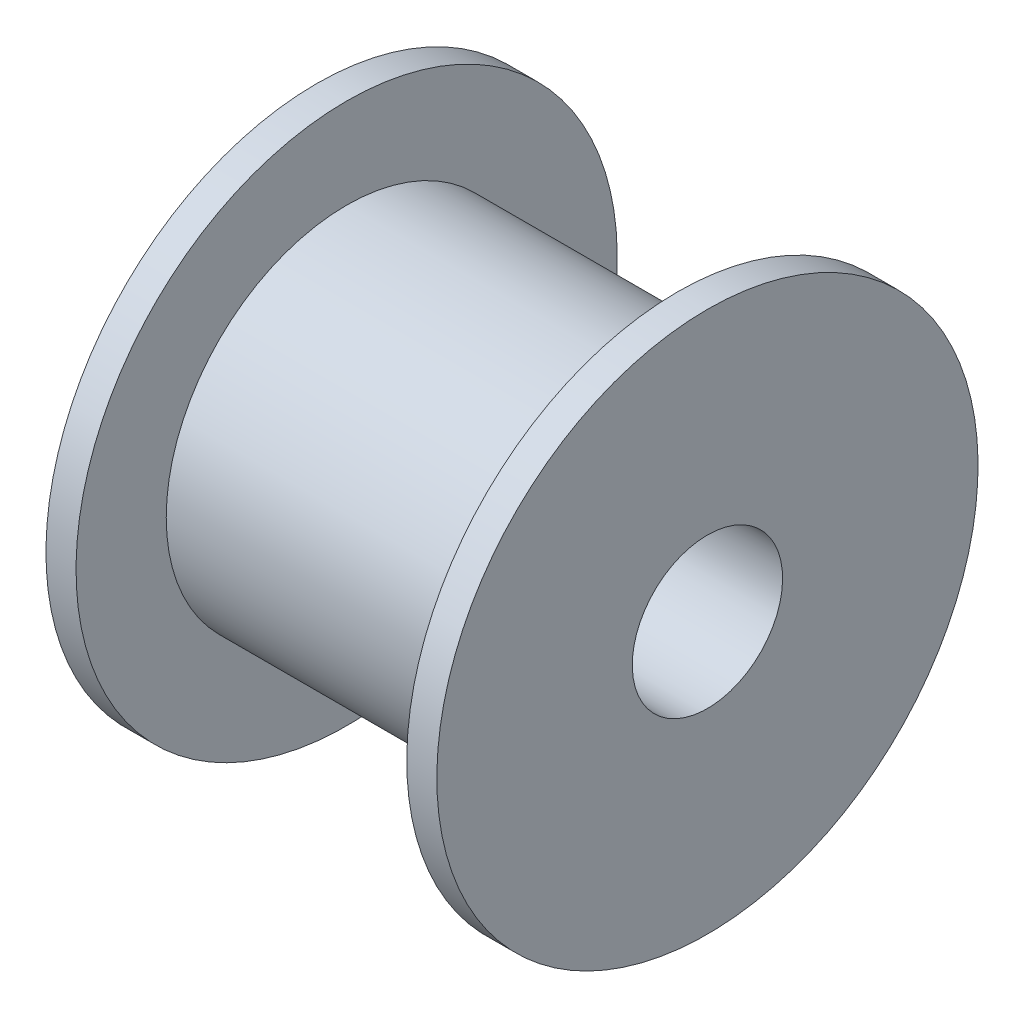
ISO-10303-21;
HEADER;
FILE_DESCRIPTION(('STEP AP214'),'2;1');
FILE_NAME('part.step','',(''),(''),'','','');
FILE_SCHEMA(('AUTOMOTIVE_DESIGN { 1 0 10303 214 1 1 1 1 }'));
ENDSEC;
DATA;
#1=APPLICATION_CONTEXT('core data for automotive mechanical design processes');
#2=APPLICATION_PROTOCOL_DEFINITION('international standard','automotive_design',2000,#1);
#3=PRODUCT_CONTEXT('',#1,'mechanical');
#4=PRODUCT('Part','Part','',(#3));
#5=PRODUCT_RELATED_PRODUCT_CATEGORY('part','',(#4));
#6=PRODUCT_DEFINITION_FORMATION('','',#4);
#7=PRODUCT_DEFINITION_CONTEXT('part definition',#1,'design');
#8=PRODUCT_DEFINITION('design','',#6,#7);
#9=PRODUCT_DEFINITION_SHAPE('','',#8);
#10=(LENGTH_UNIT() NAMED_UNIT(*) SI_UNIT(.MILLI.,.METRE.));
#11=(NAMED_UNIT(*) PLANE_ANGLE_UNIT() SI_UNIT($,.RADIAN.));
#12=(NAMED_UNIT(*) SI_UNIT($,.STERADIAN.) SOLID_ANGLE_UNIT());
#13=UNCERTAINTY_MEASURE_WITH_UNIT(LENGTH_MEASURE(1.E-05),#10,'distance_accuracy_value','');
#14=(GEOMETRIC_REPRESENTATION_CONTEXT(3) GLOBAL_UNCERTAINTY_ASSIGNED_CONTEXT((#13)) GLOBAL_UNIT_ASSIGNED_CONTEXT((#10,
#11,#12)) REPRESENTATION_CONTEXT('',''));
#15=CARTESIAN_POINT('',(0.,0.,0.));
#16=DIRECTION('',(0.,0.,1.));
#17=DIRECTION('',(1.,0.,0.));
#18=AXIS2_PLACEMENT_3D('',#15,#16,#17);
#19=CARTESIAN_POINT('',(-13.,0.,0.));
#20=DIRECTION('',(1.,0.,0.));
#21=DIRECTION('',(0.,1.,0.));
#22=AXIS2_PLACEMENT_3D('',#19,#20,#21);
#23=PLANE('',#22);
#24=CARTESIAN_POINT('',(-13.,0.,0.));
#25=DIRECTION('',(1.,0.,0.));
#26=DIRECTION('',(0.,1.,0.));
#27=AXIS2_PLACEMENT_3D('',#24,#25,#26);
#28=CIRCLE('',#27,9.);
#29=CARTESIAN_POINT('',(-13.,9.,0.));
#30=VERTEX_POINT('',#29);
#31=EDGE_CURVE('E60',#30,#30,#28,.T.);
#32=ORIENTED_EDGE('',*,*,#31,.F.);
#33=EDGE_LOOP('',(#32));
#34=FACE_BOUND('',#33,.T.);
#35=CARTESIAN_POINT('',(-13.,0.,0.));
#36=DIRECTION('',(1.,0.,0.));
#37=DIRECTION('',(0.,1.,0.));
#38=AXIS2_PLACEMENT_3D('',#35,#36,#37);
#39=CIRCLE('',#38,2.5);
#40=CARTESIAN_POINT('',(-13.,2.5,0.));
#41=VERTEX_POINT('',#40);
#42=EDGE_CURVE('E10',#41,#41,#39,.T.);
#43=ORIENTED_EDGE('',*,*,#42,.T.);
#44=EDGE_LOOP('',(#43));
#45=FACE_BOUND('',#44,.T.);
#46=ADVANCED_FACE('F32',(#34,#45),#23,.F.);
#47=CARTESIAN_POINT('',(0.,0.,0.));
#48=DIRECTION('',(1.,0.,0.));
#49=DIRECTION('',(0.,1.,0.));
#50=AXIS2_PLACEMENT_3D('',#47,#48,#49);
#51=CYLINDRICAL_SURFACE('',#50,2.5);
#52=CARTESIAN_POINT('',(0.,0.,0.));
#53=DIRECTION('',(1.,0.,0.));
#54=DIRECTION('',(0.,1.,0.));
#55=AXIS2_PLACEMENT_3D('',#52,#53,#54);
#56=CIRCLE('',#55,2.5);
#57=CARTESIAN_POINT('',(0.,2.5,0.));
#58=VERTEX_POINT('',#57);
#59=EDGE_CURVE('E38',#58,#58,#56,.T.);
#60=ORIENTED_EDGE('',*,*,#59,.T.);
#61=EDGE_LOOP('',(#60));
#62=FACE_BOUND('',#61,.T.);
#63=ORIENTED_EDGE('',*,*,#42,.F.);
#64=EDGE_LOOP('',(#63));
#65=FACE_BOUND('',#64,.T.);
#66=ADVANCED_FACE('F67',(#62,#65),#51,.F.);
#67=CARTESIAN_POINT('',(0.,0.,0.));
#68=DIRECTION('',(-1.,0.,0.));
#69=DIRECTION('',(0.,-1.,0.));
#70=AXIS2_PLACEMENT_3D('',#67,#68,#69);
#71=PLANE('',#70);
#72=ORIENTED_EDGE('',*,*,#59,.F.);
#73=EDGE_LOOP('',(#72));
#74=FACE_BOUND('',#73,.T.);
#75=CARTESIAN_POINT('',(0.,0.,0.));
#76=DIRECTION('',(1.,0.,0.));
#77=DIRECTION('',(0.,1.,0.));
#78=AXIS2_PLACEMENT_3D('',#75,#76,#77);
#79=CIRCLE('',#78,9.);
#80=CARTESIAN_POINT('',(0.,9.,0.));
#81=VERTEX_POINT('',#80);
#82=EDGE_CURVE('E42',#81,#81,#79,.T.);
#83=ORIENTED_EDGE('',*,*,#82,.T.);
#84=EDGE_LOOP('',(#83));
#85=FACE_BOUND('',#84,.T.);
#86=ADVANCED_FACE('F71',(#74,#85),#71,.F.);
#87=CARTESIAN_POINT('',(0.,0.,0.));
#88=DIRECTION('',(1.,0.,0.));
#89=DIRECTION('',(0.,1.,0.));
#90=AXIS2_PLACEMENT_3D('',#87,#88,#89);
#91=CYLINDRICAL_SURFACE('',#90,9.);
#92=ORIENTED_EDGE('',*,*,#82,.F.);
#93=EDGE_LOOP('',(#92));
#94=FACE_BOUND('',#93,.T.);
#95=CARTESIAN_POINT('',(-1.,0.,0.));
#96=DIRECTION('',(1.,0.,0.));
#97=DIRECTION('',(0.,1.,0.));
#98=AXIS2_PLACEMENT_3D('',#95,#96,#97);
#99=CIRCLE('',#98,9.);
#100=CARTESIAN_POINT('',(-1.,9.,0.));
#101=VERTEX_POINT('',#100);
#102=EDGE_CURVE('E46',#101,#101,#99,.T.);
#103=ORIENTED_EDGE('',*,*,#102,.T.);
#104=EDGE_LOOP('',(#103));
#105=FACE_BOUND('',#104,.T.);
#106=ADVANCED_FACE('F75',(#94,#105),#91,.T.);
#107=CARTESIAN_POINT('',(-1.,0.,0.));
#108=DIRECTION('',(1.,0.,0.));
#109=DIRECTION('',(0.,1.,0.));
#110=AXIS2_PLACEMENT_3D('',#107,#108,#109);
#111=PLANE('',#110);
#112=ORIENTED_EDGE('',*,*,#102,.F.);
#113=EDGE_LOOP('',(#112));
#114=FACE_BOUND('',#113,.T.);
#115=CARTESIAN_POINT('',(-1.,0.,0.));
#116=DIRECTION('',(1.,0.,0.));
#117=DIRECTION('',(0.,1.,0.));
#118=AXIS2_PLACEMENT_3D('',#115,#116,#117);
#119=CIRCLE('',#118,6.);
#120=CARTESIAN_POINT('',(-1.,6.,0.));
#121=VERTEX_POINT('',#120);
#122=EDGE_CURVE('E51',#121,#121,#119,.T.);
#123=ORIENTED_EDGE('',*,*,#122,.T.);
#124=EDGE_LOOP('',(#123));
#125=FACE_BOUND('',#124,.T.);
#126=ADVANCED_FACE('F82',(#114,#125),#111,.F.);
#127=CARTESIAN_POINT('',(0.,0.,0.));
#128=DIRECTION('',(1.,0.,0.));
#129=DIRECTION('',(0.,1.,0.));
#130=AXIS2_PLACEMENT_3D('',#127,#128,#129);
#131=CYLINDRICAL_SURFACE('',#130,6.);
#132=ORIENTED_EDGE('',*,*,#122,.F.);
#133=EDGE_LOOP('',(#132));
#134=FACE_BOUND('',#133,.T.);
#135=CARTESIAN_POINT('',(-12.,0.,0.));
#136=DIRECTION('',(1.,0.,0.));
#137=DIRECTION('',(0.,1.,0.));
#138=AXIS2_PLACEMENT_3D('',#135,#136,#137);
#139=CIRCLE('',#138,6.);
#140=CARTESIAN_POINT('',(-12.,6.,0.));
#141=VERTEX_POINT('',#140);
#142=EDGE_CURVE('E54',#141,#141,#139,.T.);
#143=ORIENTED_EDGE('',*,*,#142,.T.);
#144=EDGE_LOOP('',(#143));
#145=FACE_BOUND('',#144,.T.);
#146=ADVANCED_FACE('F86',(#134,#145),#131,.T.);
#147=CARTESIAN_POINT('',(-12.,0.,0.));
#148=DIRECTION('',(-1.,0.,0.));
#149=DIRECTION('',(0.,-1.,0.));
#150=AXIS2_PLACEMENT_3D('',#147,#148,#149);
#151=PLANE('',#150);
#152=ORIENTED_EDGE('',*,*,#142,.F.);
#153=EDGE_LOOP('',(#152));
#154=FACE_BOUND('',#153,.T.);
#155=CARTESIAN_POINT('',(-12.,0.,0.));
#156=DIRECTION('',(1.,0.,0.));
#157=DIRECTION('',(0.,1.,0.));
#158=AXIS2_PLACEMENT_3D('',#155,#156,#157);
#159=CIRCLE('',#158,9.);
#160=CARTESIAN_POINT('',(-12.,9.,0.));
#161=VERTEX_POINT('',#160);
#162=EDGE_CURVE('E57',#161,#161,#159,.T.);
#163=ORIENTED_EDGE('',*,*,#162,.T.);
#164=EDGE_LOOP('',(#163));
#165=FACE_BOUND('',#164,.T.);
#166=ADVANCED_FACE('F90',(#154,#165),#151,.F.);
#167=CARTESIAN_POINT('',(0.,0.,0.));
#168=DIRECTION('',(1.,0.,0.));
#169=DIRECTION('',(0.,1.,0.));
#170=AXIS2_PLACEMENT_3D('',#167,#168,#169);
#171=CYLINDRICAL_SURFACE('',#170,9.);
#172=ORIENTED_EDGE('',*,*,#162,.F.);
#173=EDGE_LOOP('',(#172));
#174=FACE_BOUND('',#173,.T.);
#175=ORIENTED_EDGE('',*,*,#31,.T.);
#176=EDGE_LOOP('',(#175));
#177=FACE_BOUND('',#176,.T.);
#178=ADVANCED_FACE('F64',(#174,#177),#171,.T.);
#179=CLOSED_SHELL('',(#46,#66,#86,#106,#126,#146,#166,#178));
#180=MANIFOLD_SOLID_BREP('B2',#179);
#181=ADVANCED_BREP_SHAPE_REPRESENTATION('',(#18,#180),#14);
#182=SHAPE_DEFINITION_REPRESENTATION(#9,#181);
ENDSEC;
END-ISO-10303-21;
